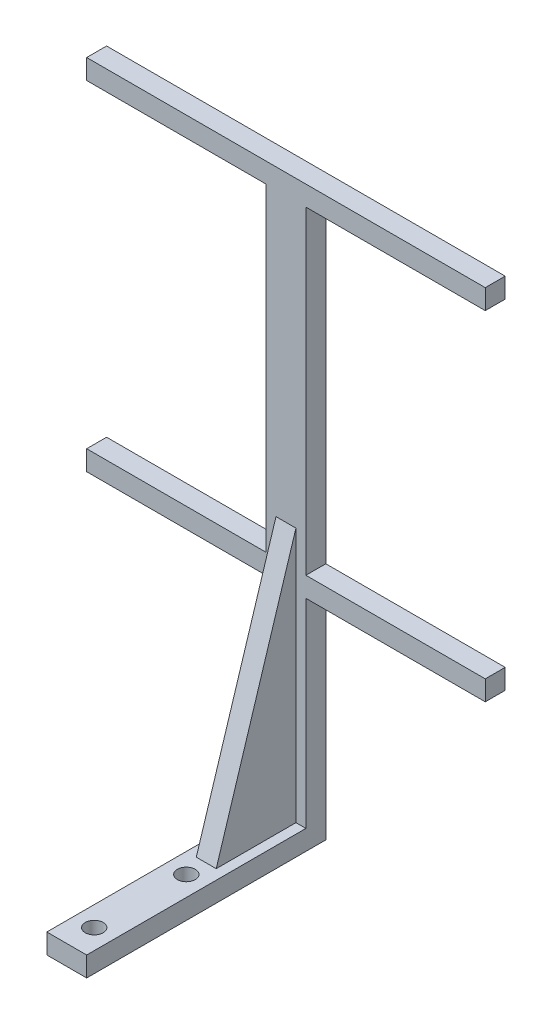
ISO-10303-21;
HEADER;
FILE_DESCRIPTION(('STEP AP214'),'2;1');
FILE_NAME('part.step','',(''),(''),'','','');
FILE_SCHEMA(('AUTOMOTIVE_DESIGN { 1 0 10303 214 1 1 1 1 }'));
ENDSEC;
DATA;
#1=APPLICATION_CONTEXT('core data for automotive mechanical design processes');
#2=APPLICATION_PROTOCOL_DEFINITION('international standard','automotive_design',2000,#1);
#3=PRODUCT_CONTEXT('',#1,'mechanical');
#4=PRODUCT('Part','Part','',(#3));
#5=PRODUCT_RELATED_PRODUCT_CATEGORY('part','',(#4));
#6=PRODUCT_DEFINITION_FORMATION('','',#4);
#7=PRODUCT_DEFINITION_CONTEXT('part definition',#1,'design');
#8=PRODUCT_DEFINITION('design','',#6,#7);
#9=PRODUCT_DEFINITION_SHAPE('','',#8);
#10=(LENGTH_UNIT() NAMED_UNIT(*) SI_UNIT(.MILLI.,.METRE.));
#11=(NAMED_UNIT(*) PLANE_ANGLE_UNIT() SI_UNIT($,.RADIAN.));
#12=(NAMED_UNIT(*) SI_UNIT($,.STERADIAN.) SOLID_ANGLE_UNIT());
#13=UNCERTAINTY_MEASURE_WITH_UNIT(LENGTH_MEASURE(1.E-05),#10,'distance_accuracy_value','');
#14=(GEOMETRIC_REPRESENTATION_CONTEXT(3) GLOBAL_UNCERTAINTY_ASSIGNED_CONTEXT((#13)) GLOBAL_UNIT_ASSIGNED_CONTEXT((#10,
#11,#12)) REPRESENTATION_CONTEXT('',''));
#15=CARTESIAN_POINT('',(0.,0.,0.));
#16=DIRECTION('',(0.,0.,1.));
#17=DIRECTION('',(1.,0.,0.));
#18=AXIS2_PLACEMENT_3D('',#15,#16,#17);
#19=CARTESIAN_POINT('',(4.99999999999999,5.,-30.));
#20=DIRECTION('',(-1.,0.,0.));
#21=DIRECTION('',(0.,0.,1.));
#22=AXIS2_PLACEMENT_3D('',#19,#20,#21);
#23=PLANE('',#22);
#24=DIRECTION('',(0.,-1.,0.));
#25=VECTOR('',#24,1.);
#26=CARTESIAN_POINT('',(4.99999999999999,5.,-30.));
#27=LINE('',#26,#25);
#28=CARTESIAN_POINT('',(4.99999999999999,55.,-30.));
#29=VERTEX_POINT('',#28);
#30=CARTESIAN_POINT('',(4.99999999999999,0.,-30.));
#31=VERTEX_POINT('',#30);
#32=EDGE_CURVE('E51',#29,#31,#27,.T.);
#33=ORIENTED_EDGE('',*,*,#32,.F.);
#34=DIRECTION('',(0.,0.,1.));
#35=VECTOR('',#34,1.);
#36=CARTESIAN_POINT('',(4.99999999999999,55.,-30.));
#37=LINE('',#36,#35);
#38=CARTESIAN_POINT('',(5.,55.,-25.));
#39=VERTEX_POINT('',#38);
#40=EDGE_CURVE('E237',#29,#39,#37,.T.);
#41=ORIENTED_EDGE('',*,*,#40,.T.);
#42=DIRECTION('',(0.,-1.,0.));
#43=VECTOR('',#42,1.);
#44=CARTESIAN_POINT('',(5.,145.,-25.));
#45=LINE('',#44,#43);
#46=CARTESIAN_POINT('',(5.,5.,-25.));
#47=VERTEX_POINT('',#46);
#48=EDGE_CURVE('E295',#39,#47,#45,.T.);
#49=ORIENTED_EDGE('',*,*,#48,.T.);
#50=DIRECTION('',(0.,0.,-1.));
#51=VECTOR('',#50,1.);
#52=CARTESIAN_POINT('',(4.99999999999999,5.,-30.));
#53=LINE('',#52,#51);
#54=CARTESIAN_POINT('',(5.,5.,30.));
#55=VERTEX_POINT('',#54);
#56=EDGE_CURVE('E305',#55,#47,#53,.T.);
#57=ORIENTED_EDGE('',*,*,#56,.F.);
#58=DIRECTION('',(0.,-1.,0.));
#59=VECTOR('',#58,1.);
#60=CARTESIAN_POINT('',(5.,5.,30.));
#61=LINE('',#60,#59);
#62=CARTESIAN_POINT('',(5.,0.,30.));
#63=VERTEX_POINT('',#62);
#64=EDGE_CURVE('E313',#55,#63,#61,.T.);
#65=ORIENTED_EDGE('',*,*,#64,.T.);
#66=DIRECTION('',(0.,0.,-1.));
#67=VECTOR('',#66,1.);
#68=CARTESIAN_POINT('',(4.99999999999999,0.,-30.));
#69=LINE('',#68,#67);
#70=EDGE_CURVE('E304',#63,#31,#69,.T.);
#71=ORIENTED_EDGE('',*,*,#70,.T.);
#72=EDGE_LOOP('',(#33,#41,#49,#57,#65,#71));
#73=FACE_BOUND('',#72,.T.);
#74=ADVANCED_FACE('F36',(#73),#23,.F.);
#75=CARTESIAN_POINT('',(-5.00000000000001,5.,-30.));
#76=DIRECTION('',(1.,0.,0.));
#77=DIRECTION('',(0.,0.,-1.));
#78=AXIS2_PLACEMENT_3D('',#75,#76,#77);
#79=PLANE('',#78);
#80=DIRECTION('',(0.,-1.,0.));
#81=VECTOR('',#80,1.);
#82=CARTESIAN_POINT('',(-5.,145.,-25.));
#83=LINE('',#82,#81);
#84=CARTESIAN_POINT('',(-5.,55.,-25.));
#85=VERTEX_POINT('',#84);
#86=CARTESIAN_POINT('',(-5.00000000000001,5.,-25.));
#87=VERTEX_POINT('',#86);
#88=EDGE_CURVE('E300',#85,#87,#83,.T.);
#89=ORIENTED_EDGE('',*,*,#88,.F.);
#90=DIRECTION('',(0.,0.,-1.));
#91=VECTOR('',#90,1.);
#92=CARTESIAN_POINT('',(-5.00000000000001,55.,-30.));
#93=LINE('',#92,#91);
#94=CARTESIAN_POINT('',(-5.,55.,-30.));
#95=VERTEX_POINT('',#94);
#96=EDGE_CURVE('E234',#85,#95,#93,.T.);
#97=ORIENTED_EDGE('',*,*,#96,.T.);
#98=DIRECTION('',(0.,-1.,0.));
#99=VECTOR('',#98,1.);
#100=CARTESIAN_POINT('',(-5.00000000000001,5.,-30.));
#101=LINE('',#100,#99);
#102=CARTESIAN_POINT('',(-5.00000000000001,0.,-30.));
#103=VERTEX_POINT('',#102);
#104=EDGE_CURVE('E326',#95,#103,#101,.T.);
#105=ORIENTED_EDGE('',*,*,#104,.T.);
#106=DIRECTION('',(0.,0.,1.));
#107=VECTOR('',#106,1.);
#108=CARTESIAN_POINT('',(-5.00000000000001,0.,-30.));
#109=LINE('',#108,#107);
#110=CARTESIAN_POINT('',(-5.,0.,30.));
#111=VERTEX_POINT('',#110);
#112=EDGE_CURVE('E318',#103,#111,#109,.T.);
#113=ORIENTED_EDGE('',*,*,#112,.T.);
#114=DIRECTION('',(0.,-1.,0.));
#115=VECTOR('',#114,1.);
#116=CARTESIAN_POINT('',(-5.,5.,30.));
#117=LINE('',#116,#115);
#118=CARTESIAN_POINT('',(-5.,5.,30.));
#119=VERTEX_POINT('',#118);
#120=EDGE_CURVE('E323',#119,#111,#117,.T.);
#121=ORIENTED_EDGE('',*,*,#120,.F.);
#122=DIRECTION('',(0.,0.,1.));
#123=VECTOR('',#122,1.);
#124=CARTESIAN_POINT('',(-5.00000000000001,5.,-30.));
#125=LINE('',#124,#123);
#126=EDGE_CURVE('E308',#87,#119,#125,.T.);
#127=ORIENTED_EDGE('',*,*,#126,.F.);
#128=EDGE_LOOP('',(#89,#97,#105,#113,#121,#127));
#129=FACE_BOUND('',#128,.T.);
#130=ADVANCED_FACE('F354',(#129),#79,.F.);
#131=CARTESIAN_POINT('',(5.,140.,-25.));
#132=VERTEX_POINT('',#131);
#133=CARTESIAN_POINT('',(5.,60.,-25.));
#134=VERTEX_POINT('',#133);
#135=EDGE_CURVE('E298',#132,#134,#45,.T.);
#136=ORIENTED_EDGE('',*,*,#135,.T.);
#137=DIRECTION('',(0.,0.,-1.));
#138=VECTOR('',#137,1.);
#139=CARTESIAN_POINT('',(4.99999999999999,60.,-30.));
#140=LINE('',#139,#138);
#141=CARTESIAN_POINT('',(4.99999999999999,60.,-30.));
#142=VERTEX_POINT('',#141);
#143=EDGE_CURVE('E59',#134,#142,#140,.T.);
#144=ORIENTED_EDGE('',*,*,#143,.T.);
#145=CARTESIAN_POINT('',(4.99999999999999,140.,-30.));
#146=VERTEX_POINT('',#145);
#147=EDGE_CURVE('E198',#146,#142,#27,.T.);
#148=ORIENTED_EDGE('',*,*,#147,.F.);
#149=DIRECTION('',(0.,0.,1.));
#150=VECTOR('',#149,1.);
#151=CARTESIAN_POINT('',(4.99999999999999,140.,-30.));
#152=LINE('',#151,#150);
#153=EDGE_CURVE('E271',#146,#132,#152,.T.);
#154=ORIENTED_EDGE('',*,*,#153,.T.);
#155=EDGE_LOOP('',(#136,#144,#148,#154));
#156=FACE_BOUND('',#155,.T.);
#157=ADVANCED_FACE('F38',(#156),#23,.F.);
#158=CARTESIAN_POINT('',(-5.00000000000001,5.,-30.));
#159=DIRECTION('',(0.,0.,1.));
#160=DIRECTION('',(1.,0.,0.));
#161=AXIS2_PLACEMENT_3D('',#158,#159,#160);
#162=PLANE('',#161);
#163=ORIENTED_EDGE('',*,*,#147,.T.);
#164=DIRECTION('',(-1.,0.,0.));
#165=VECTOR('',#164,1.);
#166=CARTESIAN_POINT('',(-50.0000000000017,60.,-30.));
#167=LINE('',#166,#165);
#168=CARTESIAN_POINT('',(49.9999999999983,60.,-30.));
#169=VERTEX_POINT('',#168);
#170=EDGE_CURVE('E182',#169,#142,#167,.T.);
#171=ORIENTED_EDGE('',*,*,#170,.F.);
#172=DIRECTION('',(0.,1.,0.));
#173=VECTOR('',#172,1.);
#174=CARTESIAN_POINT('',(49.9999999999983,60.,-30.));
#175=LINE('',#174,#173);
#176=CARTESIAN_POINT('',(49.9999999999983,55.,-30.));
#177=VERTEX_POINT('',#176);
#178=EDGE_CURVE('E196',#177,#169,#175,.T.);
#179=ORIENTED_EDGE('',*,*,#178,.F.);
#180=DIRECTION('',(1.,0.,0.));
#181=VECTOR('',#180,1.);
#182=CARTESIAN_POINT('',(-50.0000000000017,55.,-30.));
#183=LINE('',#182,#181);
#184=EDGE_CURVE('E216',#29,#177,#183,.T.);
#185=ORIENTED_EDGE('',*,*,#184,.F.);
#186=ORIENTED_EDGE('',*,*,#32,.T.);
#187=DIRECTION('',(-1.,0.,0.));
#188=VECTOR('',#187,1.);
#189=CARTESIAN_POINT('',(-5.00000000000001,0.,-30.));
#190=LINE('',#189,#188);
#191=EDGE_CURVE('E315',#31,#103,#190,.T.);
#192=ORIENTED_EDGE('',*,*,#191,.T.);
#193=ORIENTED_EDGE('',*,*,#104,.F.);
#194=CARTESIAN_POINT('',(-50.0000000000017,55.,-30.));
#195=VERTEX_POINT('',#194);
#196=EDGE_CURVE('E190',#195,#95,#183,.T.);
#197=ORIENTED_EDGE('',*,*,#196,.F.);
#198=DIRECTION('',(0.,-1.,0.));
#199=VECTOR('',#198,1.);
#200=CARTESIAN_POINT('',(-50.0000000000017,60.,-30.));
#201=LINE('',#200,#199);
#202=CARTESIAN_POINT('',(-50.0000000000017,60.,-30.));
#203=VERTEX_POINT('',#202);
#204=EDGE_CURVE('E199',#203,#195,#201,.T.);
#205=ORIENTED_EDGE('',*,*,#204,.F.);
#206=CARTESIAN_POINT('',(-5.,60.,-30.));
#207=VERTEX_POINT('',#206);
#208=EDGE_CURVE('E200',#207,#203,#167,.T.);
#209=ORIENTED_EDGE('',*,*,#208,.F.);
#210=CARTESIAN_POINT('',(-5.,140.,-30.));
#211=VERTEX_POINT('',#210);
#212=EDGE_CURVE('E327',#211,#207,#101,.T.);
#213=ORIENTED_EDGE('',*,*,#212,.F.);
#214=DIRECTION('',(1.,0.,0.));
#215=VECTOR('',#214,1.);
#216=CARTESIAN_POINT('',(-50.0000000000026,140.,-30.));
#217=LINE('',#216,#215);
#218=CARTESIAN_POINT('',(-50.0000000000026,140.,-30.));
#219=VERTEX_POINT('',#218);
#220=EDGE_CURVE('E248',#219,#211,#217,.T.);
#221=ORIENTED_EDGE('',*,*,#220,.F.);
#222=DIRECTION('',(0.,-1.,0.));
#223=VECTOR('',#222,1.);
#224=CARTESIAN_POINT('',(-50.0000000000026,145.,-30.));
#225=LINE('',#224,#223);
#226=CARTESIAN_POINT('',(-50.0000000000026,145.,-30.));
#227=VERTEX_POINT('',#226);
#228=EDGE_CURVE('E243',#227,#219,#225,.T.);
#229=ORIENTED_EDGE('',*,*,#228,.F.);
#230=DIRECTION('',(-1.,0.,0.));
#231=VECTOR('',#230,1.);
#232=CARTESIAN_POINT('',(-5.00000000000001,145.,-30.));
#233=LINE('',#232,#231);
#234=CARTESIAN_POINT('',(49.9999999999974,145.,-30.));
#235=VERTEX_POINT('',#234);
#236=EDGE_CURVE('E290',#235,#227,#233,.T.);
#237=ORIENTED_EDGE('',*,*,#236,.F.);
#238=DIRECTION('',(0.,1.,0.));
#239=VECTOR('',#238,1.);
#240=CARTESIAN_POINT('',(49.9999999999974,145.,-30.));
#241=LINE('',#240,#239);
#242=CARTESIAN_POINT('',(49.9999999999974,140.,-30.));
#243=VERTEX_POINT('',#242);
#244=EDGE_CURVE('E240',#243,#235,#241,.T.);
#245=ORIENTED_EDGE('',*,*,#244,.F.);
#246=EDGE_CURVE('E247',#146,#243,#217,.T.);
#247=ORIENTED_EDGE('',*,*,#246,.F.);
#248=EDGE_LOOP('',(#163,#171,#179,#185,#186,#192,#193,#197,#205,#209,#213,#221,#229,#237,#245,#247));
#249=FACE_BOUND('',#248,.T.);
#250=ADVANCED_FACE('F194',(#249),#162,.F.);
#251=ORIENTED_EDGE('',*,*,#212,.T.);
#252=DIRECTION('',(0.,0.,1.));
#253=VECTOR('',#252,1.);
#254=CARTESIAN_POINT('',(-5.00000000000001,60.,-30.));
#255=LINE('',#254,#253);
#256=CARTESIAN_POINT('',(-5.,60.,-25.));
#257=VERTEX_POINT('',#256);
#258=EDGE_CURVE('E226',#207,#257,#255,.T.);
#259=ORIENTED_EDGE('',*,*,#258,.T.);
#260=CARTESIAN_POINT('',(-5.,140.,-25.));
#261=VERTEX_POINT('',#260);
#262=EDGE_CURVE('E301',#261,#257,#83,.T.);
#263=ORIENTED_EDGE('',*,*,#262,.F.);
#264=DIRECTION('',(0.,0.,-1.));
#265=VECTOR('',#264,1.);
#266=CARTESIAN_POINT('',(-5.00000000000001,140.,-30.));
#267=LINE('',#266,#265);
#268=EDGE_CURVE('E261',#261,#211,#267,.T.);
#269=ORIENTED_EDGE('',*,*,#268,.T.);
#270=EDGE_LOOP('',(#251,#259,#263,#269));
#271=FACE_BOUND('',#270,.T.);
#272=ADVANCED_FACE('F389',(#271),#79,.F.);
#273=CARTESIAN_POINT('',(-5.,5.,30.));
#274=DIRECTION('',(0.,0.,-1.));
#275=DIRECTION('',(-1.,0.,0.));
#276=AXIS2_PLACEMENT_3D('',#273,#274,#275);
#277=PLANE('',#276);
#278=DIRECTION('',(1.,0.,0.));
#279=VECTOR('',#278,1.);
#280=CARTESIAN_POINT('',(-5.,0.,30.));
#281=LINE('',#280,#279);
#282=EDGE_CURVE('E309',#111,#63,#281,.T.);
#283=ORIENTED_EDGE('',*,*,#282,.T.);
#284=ORIENTED_EDGE('',*,*,#64,.F.);
#285=DIRECTION('',(1.,0.,0.));
#286=VECTOR('',#285,1.);
#287=CARTESIAN_POINT('',(-5.,5.,30.));
#288=LINE('',#287,#286);
#289=EDGE_CURVE('E311',#119,#55,#288,.T.);
#290=ORIENTED_EDGE('',*,*,#289,.F.);
#291=ORIENTED_EDGE('',*,*,#120,.T.);
#292=EDGE_LOOP('',(#283,#284,#290,#291));
#293=FACE_BOUND('',#292,.T.);
#294=ADVANCED_FACE('F360',(#293),#277,.F.);
#295=CARTESIAN_POINT('',(0.,5.,0.));
#296=DIRECTION('',(0.,1.,0.));
#297=DIRECTION('',(0.,0.,1.));
#298=AXIS2_PLACEMENT_3D('',#295,#296,#297);
#299=PLANE('',#298);
#300=CARTESIAN_POINT('',(0.,5.,0.));
#301=DIRECTION('',(0.,1.,0.));
#302=DIRECTION('',(0.,0.,1.));
#303=AXIS2_PLACEMENT_3D('',#300,#301,#302);
#304=CIRCLE('',#303,2.25);
#305=CARTESIAN_POINT('',(0.,5.,2.25));
#306=VERTEX_POINT('',#305);
#307=EDGE_CURVE('E211',#306,#306,#304,.T.);
#308=ORIENTED_EDGE('',*,*,#307,.F.);
#309=EDGE_LOOP('',(#308));
#310=FACE_BOUND('',#309,.T.);
#311=CARTESIAN_POINT('',(0.,5.,23.1031933920463));
#312=DIRECTION('',(0.,1.,0.));
#313=DIRECTION('',(0.,0.,1.));
#314=AXIS2_PLACEMENT_3D('',#311,#312,#313);
#315=CIRCLE('',#314,2.25);
#316=CARTESIAN_POINT('',(0.,5.,25.3531933920463));
#317=VERTEX_POINT('',#316);
#318=EDGE_CURVE('E576',#317,#317,#315,.T.);
#319=ORIENTED_EDGE('',*,*,#318,.F.);
#320=EDGE_LOOP('',(#319));
#321=FACE_BOUND('',#320,.T.);
#322=DIRECTION('',(0.,0.,-1.));
#323=VECTOR('',#322,1.);
#324=CARTESIAN_POINT('',(2.5,5.,0.));
#325=LINE('',#324,#323);
#326=CARTESIAN_POINT('',(2.5,5.,-5.00000000000001));
#327=VERTEX_POINT('',#326);
#328=CARTESIAN_POINT('',(2.5,5.,-25.));
#329=VERTEX_POINT('',#328);
#330=EDGE_CURVE('E283',#327,#329,#325,.T.);
#331=ORIENTED_EDGE('',*,*,#330,.F.);
#332=DIRECTION('',(-1.,0.,0.));
#333=VECTOR('',#332,1.);
#334=CARTESIAN_POINT('',(0.,5.,-5.00000000000001));
#335=LINE('',#334,#333);
#336=CARTESIAN_POINT('',(-2.5,5.,-5.00000000000001));
#337=VERTEX_POINT('',#336);
#338=EDGE_CURVE('E286',#337,#327,#335,.F.);
#339=ORIENTED_EDGE('',*,*,#338,.F.);
#340=DIRECTION('',(0.,0.,-1.));
#341=VECTOR('',#340,1.);
#342=CARTESIAN_POINT('',(-2.5,5.,0.));
#343=LINE('',#342,#341);
#344=CARTESIAN_POINT('',(-2.5,5.,-25.));
#345=VERTEX_POINT('',#344);
#346=EDGE_CURVE('E278',#337,#345,#343,.T.);
#347=ORIENTED_EDGE('',*,*,#346,.T.);
#348=DIRECTION('',(1.,0.,0.));
#349=VECTOR('',#348,1.);
#350=CARTESIAN_POINT('',(-5.,5.,-25.));
#351=LINE('',#350,#349);
#352=EDGE_CURVE('E293',#87,#345,#351,.T.);
#353=ORIENTED_EDGE('',*,*,#352,.F.);
#354=ORIENTED_EDGE('',*,*,#126,.T.);
#355=ORIENTED_EDGE('',*,*,#289,.T.);
#356=ORIENTED_EDGE('',*,*,#56,.T.);
#357=EDGE_CURVE('E289',#329,#47,#351,.T.);
#358=ORIENTED_EDGE('',*,*,#357,.F.);
#359=EDGE_LOOP('',(#331,#339,#347,#353,#354,#355,#356,#358));
#360=FACE_BOUND('',#359,.T.);
#361=ADVANCED_FACE('F346',(#310,#321,#360),#299,.T.);
#362=CARTESIAN_POINT('',(0.,0.,0.));
#363=DIRECTION('',(0.,1.,0.));
#364=DIRECTION('',(0.,0.,1.));
#365=AXIS2_PLACEMENT_3D('',#362,#363,#364);
#366=PLANE('',#365);
#367=CARTESIAN_POINT('',(0.,0.,0.));
#368=DIRECTION('',(0.,1.,0.));
#369=DIRECTION('',(0.,0.,1.));
#370=AXIS2_PLACEMENT_3D('',#367,#368,#369);
#371=CIRCLE('',#370,2.25);
#372=CARTESIAN_POINT('',(0.,0.,2.25));
#373=VERTEX_POINT('',#372);
#374=EDGE_CURVE('E575',#373,#373,#371,.T.);
#375=ORIENTED_EDGE('',*,*,#374,.T.);
#376=EDGE_LOOP('',(#375));
#377=FACE_BOUND('',#376,.T.);
#378=CARTESIAN_POINT('',(0.,0.,23.1031933920463));
#379=DIRECTION('',(0.,1.,0.));
#380=DIRECTION('',(0.,0.,1.));
#381=AXIS2_PLACEMENT_3D('',#378,#379,#380);
#382=CIRCLE('',#381,2.25);
#383=CARTESIAN_POINT('',(0.,0.,25.3531933920463));
#384=VERTEX_POINT('',#383);
#385=EDGE_CURVE('E577',#384,#384,#382,.T.);
#386=ORIENTED_EDGE('',*,*,#385,.T.);
#387=EDGE_LOOP('',(#386));
#388=FACE_BOUND('',#387,.T.);
#389=ORIENTED_EDGE('',*,*,#112,.F.);
#390=ORIENTED_EDGE('',*,*,#191,.F.);
#391=ORIENTED_EDGE('',*,*,#70,.F.);
#392=ORIENTED_EDGE('',*,*,#282,.F.);
#393=EDGE_LOOP('',(#389,#390,#391,#392));
#394=FACE_BOUND('',#393,.T.);
#395=ADVANCED_FACE('F369',(#377,#388,#394),#366,.F.);
#396=CARTESIAN_POINT('',(-5.,145.,-25.));
#397=DIRECTION('',(0.,0.,-1.));
#398=DIRECTION('',(-1.,0.,0.));
#399=AXIS2_PLACEMENT_3D('',#396,#397,#398);
#400=PLANE('',#399);
#401=ORIENTED_EDGE('',*,*,#262,.T.);
#402=DIRECTION('',(-1.,0.,0.));
#403=VECTOR('',#402,1.);
#404=CARTESIAN_POINT('',(-50.0000000000017,60.,-25.));
#405=LINE('',#404,#403);
#406=CARTESIAN_POINT('',(-50.0000000000017,60.,-25.));
#407=VERTEX_POINT('',#406);
#408=EDGE_CURVE('E220',#257,#407,#405,.T.);
#409=ORIENTED_EDGE('',*,*,#408,.T.);
#410=DIRECTION('',(0.,-1.,0.));
#411=VECTOR('',#410,1.);
#412=CARTESIAN_POINT('',(-50.0000000000017,60.,-25.));
#413=LINE('',#412,#411);
#414=CARTESIAN_POINT('',(-50.0000000000017,55.,-25.));
#415=VERTEX_POINT('',#414);
#416=EDGE_CURVE('E222',#407,#415,#413,.T.);
#417=ORIENTED_EDGE('',*,*,#416,.T.);
#418=DIRECTION('',(1.,0.,0.));
#419=VECTOR('',#418,1.);
#420=CARTESIAN_POINT('',(-50.0000000000017,55.,-25.));
#421=LINE('',#420,#419);
#422=EDGE_CURVE('E206',#415,#85,#421,.T.);
#423=ORIENTED_EDGE('',*,*,#422,.T.);
#424=ORIENTED_EDGE('',*,*,#88,.T.);
#425=ORIENTED_EDGE('',*,*,#352,.T.);
#426=DIRECTION('',(0.,-1.,0.));
#427=VECTOR('',#426,1.);
#428=CARTESIAN_POINT('',(-2.5,145.,-25.));
#429=LINE('',#428,#427);
#430=CARTESIAN_POINT('',(-2.5,69.,-25.));
#431=VERTEX_POINT('',#430);
#432=EDGE_CURVE('E331',#431,#345,#429,.T.);
#433=ORIENTED_EDGE('',*,*,#432,.F.);
#434=DIRECTION('',(-1.,0.,0.));
#435=VECTOR('',#434,1.);
#436=CARTESIAN_POINT('',(-5.,69.,-25.));
#437=LINE('',#436,#435);
#438=CARTESIAN_POINT('',(2.5,69.,-25.));
#439=VERTEX_POINT('',#438);
#440=EDGE_CURVE('E44',#431,#439,#437,.F.);
#441=ORIENTED_EDGE('',*,*,#440,.T.);
#442=DIRECTION('',(0.,-1.,0.));
#443=VECTOR('',#442,1.);
#444=CARTESIAN_POINT('',(2.5,145.,-25.));
#445=LINE('',#444,#443);
#446=EDGE_CURVE('E11',#439,#329,#445,.T.);
#447=ORIENTED_EDGE('',*,*,#446,.T.);
#448=ORIENTED_EDGE('',*,*,#357,.T.);
#449=ORIENTED_EDGE('',*,*,#48,.F.);
#450=CARTESIAN_POINT('',(49.9999999999983,55.,-25.));
#451=VERTEX_POINT('',#450);
#452=EDGE_CURVE('E208',#39,#451,#421,.T.);
#453=ORIENTED_EDGE('',*,*,#452,.T.);
#454=DIRECTION('',(0.,1.,0.));
#455=VECTOR('',#454,1.);
#456=CARTESIAN_POINT('',(49.9999999999983,60.,-25.));
#457=LINE('',#456,#455);
#458=CARTESIAN_POINT('',(49.9999999999983,60.,-25.));
#459=VERTEX_POINT('',#458);
#460=EDGE_CURVE('E218',#451,#459,#457,.T.);
#461=ORIENTED_EDGE('',*,*,#460,.T.);
#462=EDGE_CURVE('E184',#459,#134,#405,.T.);
#463=ORIENTED_EDGE('',*,*,#462,.T.);
#464=ORIENTED_EDGE('',*,*,#135,.F.);
#465=DIRECTION('',(1.,0.,0.));
#466=VECTOR('',#465,1.);
#467=CARTESIAN_POINT('',(-50.0000000000026,140.,-25.));
#468=LINE('',#467,#466);
#469=CARTESIAN_POINT('',(49.9999999999974,140.,-25.));
#470=VERTEX_POINT('',#469);
#471=EDGE_CURVE('E256',#132,#470,#468,.T.);
#472=ORIENTED_EDGE('',*,*,#471,.T.);
#473=DIRECTION('',(0.,1.,0.));
#474=VECTOR('',#473,1.);
#475=CARTESIAN_POINT('',(49.9999999999974,145.,-25.));
#476=LINE('',#475,#474);
#477=CARTESIAN_POINT('',(49.9999999999974,145.,-25.));
#478=VERTEX_POINT('',#477);
#479=EDGE_CURVE('E239',#470,#478,#476,.T.);
#480=ORIENTED_EDGE('',*,*,#479,.T.);
#481=DIRECTION('',(1.,0.,0.));
#482=VECTOR('',#481,1.);
#483=CARTESIAN_POINT('',(-5.,145.,-25.));
#484=LINE('',#483,#482);
#485=CARTESIAN_POINT('',(-50.0000000000026,145.,-25.));
#486=VERTEX_POINT('',#485);
#487=EDGE_CURVE('E292',#486,#478,#484,.T.);
#488=ORIENTED_EDGE('',*,*,#487,.F.);
#489=DIRECTION('',(0.,-1.,0.));
#490=VECTOR('',#489,1.);
#491=CARTESIAN_POINT('',(-50.0000000000026,145.,-25.));
#492=LINE('',#491,#490);
#493=CARTESIAN_POINT('',(-50.0000000000026,140.,-25.));
#494=VERTEX_POINT('',#493);
#495=EDGE_CURVE('E253',#486,#494,#492,.T.);
#496=ORIENTED_EDGE('',*,*,#495,.T.);
#497=EDGE_CURVE('E244',#494,#261,#468,.T.);
#498=ORIENTED_EDGE('',*,*,#497,.T.);
#499=EDGE_LOOP('',(#401,#409,#417,#423,#424,#425,#433,#441,#447,#448,#449,#453,#461,#463,#464,
#472,#480,#488,#496,#498));
#500=FACE_BOUND('',#499,.T.);
#501=ADVANCED_FACE('F335',(#500),#400,.F.);
#502=CARTESIAN_POINT('',(0.,145.,0.));
#503=DIRECTION('',(0.,1.,0.));
#504=DIRECTION('',(0.,0.,1.));
#505=AXIS2_PLACEMENT_3D('',#502,#503,#504);
#506=PLANE('',#505);
#507=ORIENTED_EDGE('',*,*,#487,.T.);
#508=DIRECTION('',(0.,0.,1.));
#509=VECTOR('',#508,1.);
#510=CARTESIAN_POINT('',(49.9999999999974,145.,-30.));
#511=LINE('',#510,#509);
#512=EDGE_CURVE('E250',#235,#478,#511,.T.);
#513=ORIENTED_EDGE('',*,*,#512,.F.);
#514=ORIENTED_EDGE('',*,*,#236,.T.);
#515=DIRECTION('',(0.,0.,1.));
#516=VECTOR('',#515,1.);
#517=CARTESIAN_POINT('',(-50.0000000000026,145.,-30.));
#518=LINE('',#517,#516);
#519=EDGE_CURVE('E264',#227,#486,#518,.T.);
#520=ORIENTED_EDGE('',*,*,#519,.T.);
#521=EDGE_LOOP('',(#507,#513,#514,#520));
#522=FACE_BOUND('',#521,.T.);
#523=ADVANCED_FACE('F377',(#522),#506,.T.);
#524=CARTESIAN_POINT('',(0.,5.,-5.00000000000001));
#525=DIRECTION('',(0.,-0.298274993135947,-0.95447997803503));
#526=DIRECTION('',(0.,0.95447997803503,-0.298274993135947));
#527=AXIS2_PLACEMENT_3D('',#524,#525,#526);
#528=PLANE('',#527);
#529=DIRECTION('',(0.,0.95447997803503,-0.298274993135947));
#530=VECTOR('',#529,1.);
#531=CARTESIAN_POINT('',(-2.5,5.,-5.00000000000001));
#532=LINE('',#531,#530);
#533=EDGE_CURVE('E274',#337,#431,#532,.T.);
#534=ORIENTED_EDGE('',*,*,#533,.F.);
#535=ORIENTED_EDGE('',*,*,#338,.T.);
#536=DIRECTION('',(0.,0.95447997803503,-0.298274993135947));
#537=VECTOR('',#536,1.);
#538=CARTESIAN_POINT('',(2.5,5.,-5.00000000000001));
#539=LINE('',#538,#537);
#540=EDGE_CURVE('E275',#327,#439,#539,.T.);
#541=ORIENTED_EDGE('',*,*,#540,.T.);
#542=ORIENTED_EDGE('',*,*,#440,.F.);
#543=EDGE_LOOP('',(#534,#535,#541,#542));
#544=FACE_BOUND('',#543,.T.);
#545=ADVANCED_FACE('F343',(#544),#528,.F.);
#546=CARTESIAN_POINT('',(2.5,72.5,0.));
#547=DIRECTION('',(1.,0.,0.));
#548=DIRECTION('',(0.,0.,-1.));
#549=AXIS2_PLACEMENT_3D('',#546,#547,#548);
#550=PLANE('',#549);
#551=ORIENTED_EDGE('',*,*,#540,.F.);
#552=ORIENTED_EDGE('',*,*,#330,.T.);
#553=ORIENTED_EDGE('',*,*,#446,.F.);
#554=EDGE_LOOP('',(#551,#552,#553));
#555=FACE_BOUND('',#554,.T.);
#556=ADVANCED_FACE('F342',(#555),#550,.T.);
#557=CARTESIAN_POINT('',(-2.5,72.5,0.));
#558=DIRECTION('',(1.,0.,0.));
#559=DIRECTION('',(0.,0.,-1.));
#560=AXIS2_PLACEMENT_3D('',#557,#558,#559);
#561=PLANE('',#560);
#562=ORIENTED_EDGE('',*,*,#346,.F.);
#563=ORIENTED_EDGE('',*,*,#533,.T.);
#564=ORIENTED_EDGE('',*,*,#432,.T.);
#565=EDGE_LOOP('',(#562,#563,#564));
#566=FACE_BOUND('',#565,.T.);
#567=ADVANCED_FACE('F349',(#566),#561,.F.);
#568=CARTESIAN_POINT('',(-50.0000000000026,145.,-30.));
#569=DIRECTION('',(-1.,0.,0.));
#570=DIRECTION('',(0.,0.,1.));
#571=AXIS2_PLACEMENT_3D('',#568,#569,#570);
#572=PLANE('',#571);
#573=ORIENTED_EDGE('',*,*,#495,.F.);
#574=ORIENTED_EDGE('',*,*,#519,.F.);
#575=ORIENTED_EDGE('',*,*,#228,.T.);
#576=DIRECTION('',(0.,0.,1.));
#577=VECTOR('',#576,1.);
#578=CARTESIAN_POINT('',(-50.0000000000026,140.,-30.));
#579=LINE('',#578,#577);
#580=EDGE_CURVE('E262',#219,#494,#579,.T.);
#581=ORIENTED_EDGE('',*,*,#580,.T.);
#582=EDGE_LOOP('',(#573,#574,#575,#581));
#583=FACE_BOUND('',#582,.T.);
#584=ADVANCED_FACE('F430',(#583),#572,.T.);
#585=CARTESIAN_POINT('',(-50.0000000000026,140.,-30.));
#586=DIRECTION('',(0.,-1.,0.));
#587=DIRECTION('',(0.,0.,-1.));
#588=AXIS2_PLACEMENT_3D('',#585,#586,#587);
#589=PLANE('',#588);
#590=ORIENTED_EDGE('',*,*,#268,.F.);
#591=ORIENTED_EDGE('',*,*,#497,.F.);
#592=ORIENTED_EDGE('',*,*,#580,.F.);
#593=ORIENTED_EDGE('',*,*,#220,.T.);
#594=EDGE_LOOP('',(#590,#591,#592,#593));
#595=FACE_BOUND('',#594,.T.);
#596=ADVANCED_FACE('F411',(#595),#589,.T.);
#597=ORIENTED_EDGE('',*,*,#153,.F.);
#598=ORIENTED_EDGE('',*,*,#246,.T.);
#599=DIRECTION('',(0.,0.,1.));
#600=VECTOR('',#599,1.);
#601=CARTESIAN_POINT('',(49.9999999999974,140.,-30.));
#602=LINE('',#601,#600);
#603=EDGE_CURVE('E258',#243,#470,#602,.T.);
#604=ORIENTED_EDGE('',*,*,#603,.T.);
#605=ORIENTED_EDGE('',*,*,#471,.F.);
#606=EDGE_LOOP('',(#597,#598,#604,#605));
#607=FACE_BOUND('',#606,.T.);
#608=ADVANCED_FACE('F399',(#607),#589,.T.);
#609=CARTESIAN_POINT('',(49.9999999999974,145.,-30.));
#610=DIRECTION('',(1.,0.,0.));
#611=DIRECTION('',(0.,0.,-1.));
#612=AXIS2_PLACEMENT_3D('',#609,#610,#611);
#613=PLANE('',#612);
#614=ORIENTED_EDGE('',*,*,#479,.F.);
#615=ORIENTED_EDGE('',*,*,#603,.F.);
#616=ORIENTED_EDGE('',*,*,#244,.T.);
#617=ORIENTED_EDGE('',*,*,#512,.T.);
#618=EDGE_LOOP('',(#614,#615,#616,#617));
#619=FACE_BOUND('',#618,.T.);
#620=ADVANCED_FACE('F402',(#619),#613,.T.);
#621=CARTESIAN_POINT('',(-50.0000000000017,60.,-30.));
#622=DIRECTION('',(-1.,0.,0.));
#623=DIRECTION('',(0.,0.,1.));
#624=AXIS2_PLACEMENT_3D('',#621,#622,#623);
#625=PLANE('',#624);
#626=ORIENTED_EDGE('',*,*,#416,.F.);
#627=DIRECTION('',(0.,0.,1.));
#628=VECTOR('',#627,1.);
#629=CARTESIAN_POINT('',(-50.0000000000017,60.,-30.));
#630=LINE('',#629,#628);
#631=EDGE_CURVE('E189',#203,#407,#630,.T.);
#632=ORIENTED_EDGE('',*,*,#631,.F.);
#633=ORIENTED_EDGE('',*,*,#204,.T.);
#634=DIRECTION('',(0.,0.,1.));
#635=VECTOR('',#634,1.);
#636=CARTESIAN_POINT('',(-50.0000000000017,55.,-30.));
#637=LINE('',#636,#635);
#638=EDGE_CURVE('E227',#195,#415,#637,.T.);
#639=ORIENTED_EDGE('',*,*,#638,.T.);
#640=EDGE_LOOP('',(#626,#632,#633,#639));
#641=FACE_BOUND('',#640,.T.);
#642=ADVANCED_FACE('F424',(#641),#625,.T.);
#643=CARTESIAN_POINT('',(-50.0000000000017,60.,-30.));
#644=DIRECTION('',(0.,1.,0.));
#645=DIRECTION('',(0.,0.,1.));
#646=AXIS2_PLACEMENT_3D('',#643,#644,#645);
#647=PLANE('',#646);
#648=ORIENTED_EDGE('',*,*,#258,.F.);
#649=ORIENTED_EDGE('',*,*,#208,.T.);
#650=ORIENTED_EDGE('',*,*,#631,.T.);
#651=ORIENTED_EDGE('',*,*,#408,.F.);
#652=EDGE_LOOP('',(#648,#649,#650,#651));
#653=FACE_BOUND('',#652,.T.);
#654=ADVANCED_FACE('F420',(#653),#647,.T.);
#655=CARTESIAN_POINT('',(-50.0000000000017,55.,-30.));
#656=DIRECTION('',(0.,-1.,0.));
#657=DIRECTION('',(0.,0.,-1.));
#658=AXIS2_PLACEMENT_3D('',#655,#656,#657);
#659=PLANE('',#658);
#660=ORIENTED_EDGE('',*,*,#96,.F.);
#661=ORIENTED_EDGE('',*,*,#422,.F.);
#662=ORIENTED_EDGE('',*,*,#638,.F.);
#663=ORIENTED_EDGE('',*,*,#196,.T.);
#664=EDGE_LOOP('',(#660,#661,#662,#663));
#665=FACE_BOUND('',#664,.T.);
#666=ADVANCED_FACE('F428',(#665),#659,.T.);
#667=ORIENTED_EDGE('',*,*,#40,.F.);
#668=ORIENTED_EDGE('',*,*,#184,.T.);
#669=DIRECTION('',(0.,0.,1.));
#670=VECTOR('',#669,1.);
#671=CARTESIAN_POINT('',(49.9999999999983,55.,-30.));
#672=LINE('',#671,#670);
#673=EDGE_CURVE('E205',#177,#451,#672,.T.);
#674=ORIENTED_EDGE('',*,*,#673,.T.);
#675=ORIENTED_EDGE('',*,*,#452,.F.);
#676=EDGE_LOOP('',(#667,#668,#674,#675));
#677=FACE_BOUND('',#676,.T.);
#678=ADVANCED_FACE('F365',(#677),#659,.T.);
#679=ORIENTED_EDGE('',*,*,#143,.F.);
#680=ORIENTED_EDGE('',*,*,#462,.F.);
#681=DIRECTION('',(0.,0.,1.));
#682=VECTOR('',#681,1.);
#683=CARTESIAN_POINT('',(49.9999999999983,60.,-30.));
#684=LINE('',#683,#682);
#685=EDGE_CURVE('E179',#169,#459,#684,.T.);
#686=ORIENTED_EDGE('',*,*,#685,.F.);
#687=ORIENTED_EDGE('',*,*,#170,.T.);
#688=EDGE_LOOP('',(#679,#680,#686,#687));
#689=FACE_BOUND('',#688,.T.);
#690=ADVANCED_FACE('F181',(#689),#647,.T.);
#691=CARTESIAN_POINT('',(49.9999999999983,60.,-30.));
#692=DIRECTION('',(1.,0.,0.));
#693=DIRECTION('',(0.,1.,0.));
#694=AXIS2_PLACEMENT_3D('',#691,#692,#693);
#695=PLANE('',#694);
#696=ORIENTED_EDGE('',*,*,#460,.F.);
#697=ORIENTED_EDGE('',*,*,#673,.F.);
#698=ORIENTED_EDGE('',*,*,#178,.T.);
#699=ORIENTED_EDGE('',*,*,#685,.T.);
#700=EDGE_LOOP('',(#696,#697,#698,#699));
#701=FACE_BOUND('',#700,.T.);
#702=ADVANCED_FACE('F203',(#701),#695,.T.);
#703=CARTESIAN_POINT('',(0.,0.,23.1031933920463));
#704=DIRECTION('',(0.,1.,0.));
#705=DIRECTION('',(0.,0.,1.));
#706=AXIS2_PLACEMENT_3D('',#703,#704,#705);
#707=CYLINDRICAL_SURFACE('',#706,2.25);
#708=ORIENTED_EDGE('',*,*,#318,.T.);
#709=EDGE_LOOP('',(#708));
#710=FACE_BOUND('',#709,.T.);
#711=ORIENTED_EDGE('',*,*,#385,.F.);
#712=EDGE_LOOP('',(#711));
#713=FACE_BOUND('',#712,.T.);
#714=ADVANCED_FACE('F536',(#710,#713),#707,.F.);
#715=CARTESIAN_POINT('',(0.,0.,0.));
#716=DIRECTION('',(0.,1.,0.));
#717=DIRECTION('',(0.,0.,1.));
#718=AXIS2_PLACEMENT_3D('',#715,#716,#717);
#719=CYLINDRICAL_SURFACE('',#718,2.25);
#720=ORIENTED_EDGE('',*,*,#307,.T.);
#721=EDGE_LOOP('',(#720));
#722=FACE_BOUND('',#721,.T.);
#723=ORIENTED_EDGE('',*,*,#374,.F.);
#724=EDGE_LOOP('',(#723));
#725=FACE_BOUND('',#724,.T.);
#726=ADVANCED_FACE('F557',(#722,#725),#719,.F.);
#727=CLOSED_SHELL('',(#74,#130,#157,#250,#272,#294,#361,#395,#501,#523,#545,#556,#567,#584,#596,
#608,#620,#642,#654,#666,#678,#690,#702,#714,#726));
#728=MANIFOLD_SOLID_BREP('B2',#727);
#729=ADVANCED_BREP_SHAPE_REPRESENTATION('',(#18,#728),#14);
#730=SHAPE_DEFINITION_REPRESENTATION(#9,#729);
ENDSEC;
END-ISO-10303-21;
